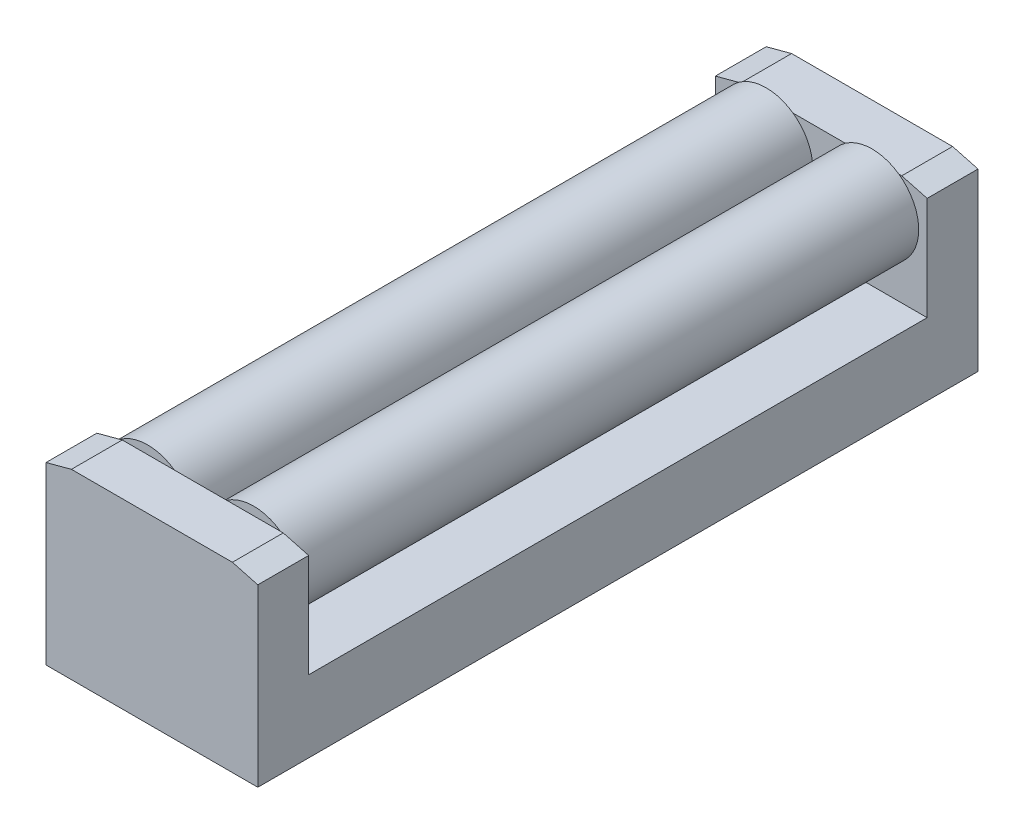
ISO-10303-21;
HEADER;
FILE_DESCRIPTION(('STEP AP214'),'2;1');
FILE_NAME('part.step','',(''),(''),'','','');
FILE_SCHEMA(('AUTOMOTIVE_DESIGN { 1 0 10303 214 1 1 1 1 }'));
ENDSEC;
DATA;
#1=APPLICATION_CONTEXT('core data for automotive mechanical design processes');
#2=APPLICATION_PROTOCOL_DEFINITION('international standard','automotive_design',2000,#1);
#3=PRODUCT_CONTEXT('',#1,'mechanical');
#4=PRODUCT('Part','Part','',(#3));
#5=PRODUCT_RELATED_PRODUCT_CATEGORY('part','',(#4));
#6=PRODUCT_DEFINITION_FORMATION('','',#4);
#7=PRODUCT_DEFINITION_CONTEXT('part definition',#1,'design');
#8=PRODUCT_DEFINITION('design','',#6,#7);
#9=PRODUCT_DEFINITION_SHAPE('','',#8);
#10=(LENGTH_UNIT() NAMED_UNIT(*) SI_UNIT(.MILLI.,.METRE.));
#11=(NAMED_UNIT(*) PLANE_ANGLE_UNIT() SI_UNIT($,.RADIAN.));
#12=(NAMED_UNIT(*) SI_UNIT($,.STERADIAN.) SOLID_ANGLE_UNIT());
#13=UNCERTAINTY_MEASURE_WITH_UNIT(LENGTH_MEASURE(1.E-05),#10,'distance_accuracy_value','');
#14=(GEOMETRIC_REPRESENTATION_CONTEXT(3) GLOBAL_UNCERTAINTY_ASSIGNED_CONTEXT((#13)) GLOBAL_UNIT_ASSIGNED_CONTEXT((#10,
#11,#12)) REPRESENTATION_CONTEXT('',''));
#15=CARTESIAN_POINT('',(0.,0.,0.));
#16=DIRECTION('',(0.,0.,1.));
#17=DIRECTION('',(1.,0.,0.));
#18=AXIS2_PLACEMENT_3D('',#15,#16,#17);
#19=CARTESIAN_POINT('',(-59.,32.1394616265751,79.));
#20=DIRECTION('',(0.,0.,1.));
#21=DIRECTION('',(1.,0.,0.));
#22=AXIS2_PLACEMENT_3D('',#19,#20,#21);
#23=PLANE('',#22);
#24=DIRECTION('',(-1.,0.,0.));
#25=VECTOR('',#24,1.);
#26=CARTESIAN_POINT('',(0.,21.5,79.));
#27=LINE('',#26,#25);
#28=CARTESIAN_POINT('',(21.9999999999999,21.5,79.));
#29=VERTEX_POINT('',#28);
#30=CARTESIAN_POINT('',(21.6622776601684,21.5,79.));
#31=VERTEX_POINT('',#30);
#32=EDGE_CURVE('E181',#29,#31,#27,.T.);
#33=ORIENTED_EDGE('',*,*,#32,.F.);
#34=DIRECTION('',(-0.965925826289069,0.258819045102519,0.));
#35=VECTOR('',#34,1.);
#36=CARTESIAN_POINT('',(22.,21.5,79.));
#37=LINE('',#36,#35);
#38=CARTESIAN_POINT('',(25.,20.6961524227066,79.));
#39=VERTEX_POINT('',#38);
#40=EDGE_CURVE('E227',#29,#39,#37,.F.);
#41=ORIENTED_EDGE('',*,*,#40,.T.);
#42=DIRECTION('',(0.,-1.,0.));
#43=VECTOR('',#42,1.);
#44=CARTESIAN_POINT('',(25.,32.139461626575,79.));
#45=LINE('',#44,#43);
#46=CARTESIAN_POINT('',(25.,8.5,79.));
#47=VERTEX_POINT('',#46);
#48=EDGE_CURVE('E335',#39,#47,#45,.T.);
#49=ORIENTED_EDGE('',*,*,#48,.T.);
#50=DIRECTION('',(1.,0.,0.));
#51=VECTOR('',#50,1.);
#52=CARTESIAN_POINT('',(-59.,8.50000000000004,79.));
#53=LINE('',#52,#51);
#54=CARTESIAN_POINT('',(0.,8.50000000000001,79.));
#55=VERTEX_POINT('',#54);
#56=EDGE_CURVE('E262',#55,#47,#53,.T.);
#57=ORIENTED_EDGE('',*,*,#56,.F.);
#58=DIRECTION('',(0.,-1.,0.));
#59=VECTOR('',#58,1.);
#60=CARTESIAN_POINT('',(0.,0.,79.));
#61=LINE('',#60,#59);
#62=CARTESIAN_POINT('',(0.,20.6961524227066,79.));
#63=VERTEX_POINT('',#62);
#64=EDGE_CURVE('E253',#63,#55,#61,.T.);
#65=ORIENTED_EDGE('',*,*,#64,.F.);
#66=DIRECTION('',(-0.965925826289069,-0.258819045102519,0.));
#67=VECTOR('',#66,1.);
#68=CARTESIAN_POINT('',(0.,20.6961524227066,79.));
#69=LINE('',#68,#67);
#70=CARTESIAN_POINT('',(2.74131560072418,21.4306857241195,79.));
#71=VERTEX_POINT('',#70);
#72=EDGE_CURVE('E224',#63,#71,#69,.F.);
#73=ORIENTED_EDGE('',*,*,#72,.T.);
#74=CARTESIAN_POINT('',(6.,17.,79.));
#75=DIRECTION('',(0.,0.,1.));
#76=DIRECTION('',(1.,0.,0.));
#77=AXIS2_PLACEMENT_3D('',#74,#75,#76);
#78=CIRCLE('',#77,5.5);
#79=CARTESIAN_POINT('',(9.16227766016838,21.5,79.));
#80=VERTEX_POINT('',#79);
#81=EDGE_CURVE('E342',#71,#80,#78,.T.);
#82=ORIENTED_EDGE('',*,*,#81,.T.);
#83=CARTESIAN_POINT('',(15.3377223398316,21.5,79.));
#84=VERTEX_POINT('',#83);
#85=EDGE_CURVE('E185',#84,#80,#27,.T.);
#86=ORIENTED_EDGE('',*,*,#85,.F.);
#87=CARTESIAN_POINT('',(18.5,17.,79.));
#88=DIRECTION('',(0.,0.,1.));
#89=DIRECTION('',(1.,0.,0.));
#90=AXIS2_PLACEMENT_3D('',#87,#88,#89);
#91=CIRCLE('',#90,5.5);
#92=EDGE_CURVE('E159',#84,#31,#91,.T.);
#93=ORIENTED_EDGE('',*,*,#92,.T.);
#94=EDGE_LOOP('',(#33,#41,#49,#57,#65,#73,#82,#86,#93));
#95=FACE_BOUND('',#94,.T.);
#96=ADVANCED_FACE('F34',(#95),#23,.F.);
#97=CARTESIAN_POINT('',(-59.,32.1394616265751,6.00000000000001));
#98=DIRECTION('',(0.,0.,-1.));
#99=DIRECTION('',(0.,1.,0.));
#100=AXIS2_PLACEMENT_3D('',#97,#98,#99);
#101=PLANE('',#100);
#102=CARTESIAN_POINT('',(6.,17.,6.00000000000001));
#103=DIRECTION('',(0.,0.,-1.));
#104=DIRECTION('',(0.,1.,0.));
#105=AXIS2_PLACEMENT_3D('',#102,#103,#104);
#106=CIRCLE('',#105,5.5);
#107=CARTESIAN_POINT('',(2.74131560072418,21.4306857241195,6.00000000000001));
#108=VERTEX_POINT('',#107);
#109=CARTESIAN_POINT('',(9.16227766016838,21.5,6.));
#110=VERTEX_POINT('',#109);
#111=EDGE_CURVE('E183',#108,#110,#106,.F.);
#112=ORIENTED_EDGE('',*,*,#111,.F.);
#113=DIRECTION('',(0.965925826289069,0.258819045102519,0.));
#114=VECTOR('',#113,1.);
#115=CARTESIAN_POINT('',(0.,20.6961524227066,6.00000000000001));
#116=LINE('',#115,#114);
#117=CARTESIAN_POINT('',(0.,20.6961524227066,6.00000000000001));
#118=VERTEX_POINT('',#117);
#119=EDGE_CURVE('E209',#108,#118,#116,.F.);
#120=ORIENTED_EDGE('',*,*,#119,.T.);
#121=DIRECTION('',(0.,1.,0.));
#122=VECTOR('',#121,1.);
#123=CARTESIAN_POINT('',(0.,0.,6.00000000000001));
#124=LINE('',#123,#122);
#125=CARTESIAN_POINT('',(0.,8.50000000000003,6.));
#126=VERTEX_POINT('',#125);
#127=EDGE_CURVE('E245',#126,#118,#124,.T.);
#128=ORIENTED_EDGE('',*,*,#127,.F.);
#129=DIRECTION('',(1.,0.,0.));
#130=VECTOR('',#129,1.);
#131=CARTESIAN_POINT('',(-59.,8.50000000000005,6.));
#132=LINE('',#131,#130);
#133=CARTESIAN_POINT('',(25.,8.50000000000001,6.));
#134=VERTEX_POINT('',#133);
#135=EDGE_CURVE('E254',#126,#134,#132,.T.);
#136=ORIENTED_EDGE('',*,*,#135,.T.);
#137=DIRECTION('',(0.,1.,0.));
#138=VECTOR('',#137,1.);
#139=CARTESIAN_POINT('',(25.,32.139461626575,6.00000000000001));
#140=LINE('',#139,#138);
#141=CARTESIAN_POINT('',(25.,20.6961524227066,6.));
#142=VERTEX_POINT('',#141);
#143=EDGE_CURVE('E325',#134,#142,#140,.T.);
#144=ORIENTED_EDGE('',*,*,#143,.T.);
#145=DIRECTION('',(0.965925826289069,-0.258819045102519,0.));
#146=VECTOR('',#145,1.);
#147=CARTESIAN_POINT('',(22.,21.5,6.00000000000001));
#148=LINE('',#147,#146);
#149=CARTESIAN_POINT('',(21.9999999999999,21.5,6.00000000000001));
#150=VERTEX_POINT('',#149);
#151=EDGE_CURVE('E207',#142,#150,#148,.F.);
#152=ORIENTED_EDGE('',*,*,#151,.T.);
#153=DIRECTION('',(1.,0.,0.));
#154=VECTOR('',#153,1.);
#155=CARTESIAN_POINT('',(0.,21.5,6.00000000000001));
#156=LINE('',#155,#154);
#157=CARTESIAN_POINT('',(21.6622776601684,21.5,6.00000000000001));
#158=VERTEX_POINT('',#157);
#159=EDGE_CURVE('E150',#158,#150,#156,.T.);
#160=ORIENTED_EDGE('',*,*,#159,.F.);
#161=CARTESIAN_POINT('',(18.5,17.,6.));
#162=DIRECTION('',(0.,0.,1.));
#163=DIRECTION('',(1.,0.,0.));
#164=AXIS2_PLACEMENT_3D('',#161,#162,#163);
#165=CIRCLE('',#164,5.5);
#166=CARTESIAN_POINT('',(15.3377223398316,21.5,6.));
#167=VERTEX_POINT('',#166);
#168=EDGE_CURVE('E156',#167,#158,#165,.T.);
#169=ORIENTED_EDGE('',*,*,#168,.F.);
#170=EDGE_CURVE('E149',#110,#167,#156,.T.);
#171=ORIENTED_EDGE('',*,*,#170,.F.);
#172=EDGE_LOOP('',(#112,#120,#128,#136,#144,#152,#160,#169,#171));
#173=FACE_BOUND('',#172,.T.);
#174=ADVANCED_FACE('F163',(#173),#101,.F.);
#175=CARTESIAN_POINT('',(0.,21.5,85.));
#176=DIRECTION('',(0.,-1.,0.));
#177=DIRECTION('',(0.,0.,-1.));
#178=AXIS2_PLACEMENT_3D('',#175,#176,#177);
#179=PLANE('',#178);
#180=DIRECTION('',(-1.,0.,0.));
#181=VECTOR('',#180,1.);
#182=CARTESIAN_POINT('',(0.,21.5,85.));
#183=LINE('',#182,#181);
#184=CARTESIAN_POINT('',(21.9999999999999,21.5,85.));
#185=VERTEX_POINT('',#184);
#186=CARTESIAN_POINT('',(3.00000000000004,21.5,85.));
#187=VERTEX_POINT('',#186);
#188=EDGE_CURVE('E290',#185,#187,#183,.T.);
#189=ORIENTED_EDGE('',*,*,#188,.F.);
#190=DIRECTION('',(0.,0.,-1.));
#191=VECTOR('',#190,1.);
#192=CARTESIAN_POINT('',(22.,21.5,85.));
#193=LINE('',#192,#191);
#194=EDGE_CURVE('E220',#185,#29,#193,.T.);
#195=ORIENTED_EDGE('',*,*,#194,.T.);
#196=ORIENTED_EDGE('',*,*,#32,.T.);
#197=EDGE_CURVE('E184',#31,#84,#27,.T.);
#198=ORIENTED_EDGE('',*,*,#197,.T.);
#199=ORIENTED_EDGE('',*,*,#85,.T.);
#200=CARTESIAN_POINT('',(3.00000000000004,21.5,79.));
#201=VERTEX_POINT('',#200);
#202=EDGE_CURVE('E176',#80,#201,#27,.T.);
#203=ORIENTED_EDGE('',*,*,#202,.T.);
#204=DIRECTION('',(0.,0.,1.));
#205=VECTOR('',#204,1.);
#206=CARTESIAN_POINT('',(3.00000000000004,21.5,85.));
#207=LINE('',#206,#205);
#208=EDGE_CURVE('E217',#201,#187,#207,.T.);
#209=ORIENTED_EDGE('',*,*,#208,.T.);
#210=EDGE_LOOP('',(#189,#195,#196,#198,#199,#203,#209));
#211=FACE_BOUND('',#210,.T.);
#212=ADVANCED_FACE('F409',(#211),#179,.F.);
#213=CARTESIAN_POINT('',(0.,0.,85.));
#214=DIRECTION('',(1.,0.,0.));
#215=DIRECTION('',(0.,0.,-1.));
#216=AXIS2_PLACEMENT_3D('',#213,#214,#215);
#217=PLANE('',#216);
#218=ORIENTED_EDGE('',*,*,#127,.T.);
#219=DIRECTION('',(0.,0.,-1.));
#220=VECTOR('',#219,1.);
#221=CARTESIAN_POINT('',(0.,20.6961524227066,85.));
#222=LINE('',#221,#220);
#223=CARTESIAN_POINT('',(0.,20.6961524227066,0.));
#224=VERTEX_POINT('',#223);
#225=EDGE_CURVE('E192',#118,#224,#222,.T.);
#226=ORIENTED_EDGE('',*,*,#225,.T.);
#227=DIRECTION('',(0.,-1.,0.));
#228=VECTOR('',#227,1.);
#229=CARTESIAN_POINT('',(0.,0.,0.));
#230=LINE('',#229,#228);
#231=CARTESIAN_POINT('',(0.,0.,0.));
#232=VERTEX_POINT('',#231);
#233=EDGE_CURVE('E268',#224,#232,#230,.T.);
#234=ORIENTED_EDGE('',*,*,#233,.T.);
#235=DIRECTION('',(0.,0.,-1.));
#236=VECTOR('',#235,1.);
#237=CARTESIAN_POINT('',(0.,0.,85.));
#238=LINE('',#237,#236);
#239=CARTESIAN_POINT('',(0.,0.,85.));
#240=VERTEX_POINT('',#239);
#241=EDGE_CURVE('E179',#240,#232,#238,.T.);
#242=ORIENTED_EDGE('',*,*,#241,.F.);
#243=DIRECTION('',(0.,-1.,0.));
#244=VECTOR('',#243,1.);
#245=CARTESIAN_POINT('',(0.,0.,85.));
#246=LINE('',#245,#244);
#247=CARTESIAN_POINT('',(0.,20.6961524227066,85.));
#248=VERTEX_POINT('',#247);
#249=EDGE_CURVE('E280',#248,#240,#246,.T.);
#250=ORIENTED_EDGE('',*,*,#249,.F.);
#251=DIRECTION('',(0.,0.,-1.));
#252=VECTOR('',#251,1.);
#253=CARTESIAN_POINT('',(0.,20.6961524227066,85.));
#254=LINE('',#253,#252);
#255=EDGE_CURVE('E188',#248,#63,#254,.T.);
#256=ORIENTED_EDGE('',*,*,#255,.T.);
#257=ORIENTED_EDGE('',*,*,#64,.T.);
#258=DIRECTION('',(0.,0.,-1.));
#259=VECTOR('',#258,1.);
#260=CARTESIAN_POINT('',(0.,8.50000000000001,85.));
#261=LINE('',#260,#259);
#262=EDGE_CURVE('E251',#55,#126,#261,.T.);
#263=ORIENTED_EDGE('',*,*,#262,.T.);
#264=EDGE_LOOP('',(#218,#226,#234,#242,#250,#256,#257,#263));
#265=FACE_BOUND('',#264,.T.);
#266=ADVANCED_FACE('F36',(#265),#217,.F.);
#267=CARTESIAN_POINT('',(0.,0.,85.));
#268=DIRECTION('',(0.,1.,0.));
#269=DIRECTION('',(0.,0.,1.));
#270=AXIS2_PLACEMENT_3D('',#267,#268,#269);
#271=PLANE('',#270);
#272=CARTESIAN_POINT('',(12.,0.,9.50000000000001));
#273=DIRECTION('',(0.,-1.,0.));
#274=DIRECTION('',(0.,0.,-1.));
#275=AXIS2_PLACEMENT_3D('',#272,#273,#274);
#276=CIRCLE('',#275,3.);
#277=CARTESIAN_POINT('',(12.,0.,6.50000000000001));
#278=VERTEX_POINT('',#277);
#279=EDGE_CURVE('E358',#278,#278,#276,.T.);
#280=ORIENTED_EDGE('',*,*,#279,.F.);
#281=EDGE_LOOP('',(#280));
#282=FACE_BOUND('',#281,.T.);
#283=CARTESIAN_POINT('',(12.,0.,75.5));
#284=DIRECTION('',(0.,-1.,0.));
#285=DIRECTION('',(0.,0.,-1.));
#286=AXIS2_PLACEMENT_3D('',#283,#284,#285);
#287=CIRCLE('',#286,3.);
#288=CARTESIAN_POINT('',(12.,0.,72.5));
#289=VERTEX_POINT('',#288);
#290=EDGE_CURVE('E350',#289,#289,#287,.T.);
#291=ORIENTED_EDGE('',*,*,#290,.F.);
#292=EDGE_LOOP('',(#291));
#293=FACE_BOUND('',#292,.T.);
#294=DIRECTION('',(1.,0.,0.));
#295=VECTOR('',#294,1.);
#296=CARTESIAN_POINT('',(0.,0.,0.));
#297=LINE('',#296,#295);
#298=CARTESIAN_POINT('',(25.,0.,0.));
#299=VERTEX_POINT('',#298);
#300=EDGE_CURVE('E271',#232,#299,#297,.T.);
#301=ORIENTED_EDGE('',*,*,#300,.T.);
#302=DIRECTION('',(0.,0.,-1.));
#303=VECTOR('',#302,1.);
#304=CARTESIAN_POINT('',(25.,0.,85.));
#305=LINE('',#304,#303);
#306=CARTESIAN_POINT('',(25.,0.,85.));
#307=VERTEX_POINT('',#306);
#308=EDGE_CURVE('E293',#307,#299,#305,.T.);
#309=ORIENTED_EDGE('',*,*,#308,.F.);
#310=DIRECTION('',(1.,0.,0.));
#311=VECTOR('',#310,1.);
#312=CARTESIAN_POINT('',(0.,0.,85.));
#313=LINE('',#312,#311);
#314=EDGE_CURVE('E283',#240,#307,#313,.T.);
#315=ORIENTED_EDGE('',*,*,#314,.F.);
#316=ORIENTED_EDGE('',*,*,#241,.T.);
#317=EDGE_LOOP('',(#301,#309,#315,#316));
#318=FACE_BOUND('',#317,.T.);
#319=ADVANCED_FACE('F367',(#282,#293,#318),#271,.F.);
#320=CARTESIAN_POINT('',(25.,0.,85.));
#321=DIRECTION('',(-1.,0.,0.));
#322=DIRECTION('',(0.,0.,1.));
#323=AXIS2_PLACEMENT_3D('',#320,#321,#322);
#324=PLANE('',#323);
#325=DIRECTION('',(0.,1.,0.));
#326=VECTOR('',#325,1.);
#327=CARTESIAN_POINT('',(25.,0.,0.));
#328=LINE('',#327,#326);
#329=CARTESIAN_POINT('',(25.,20.6961524227066,0.));
#330=VERTEX_POINT('',#329);
#331=EDGE_CURVE('E274',#299,#330,#328,.T.);
#332=ORIENTED_EDGE('',*,*,#331,.T.);
#333=DIRECTION('',(0.,0.,1.));
#334=VECTOR('',#333,1.);
#335=CARTESIAN_POINT('',(25.,20.6961524227066,85.));
#336=LINE('',#335,#334);
#337=EDGE_CURVE('E214',#330,#142,#336,.T.);
#338=ORIENTED_EDGE('',*,*,#337,.T.);
#339=ORIENTED_EDGE('',*,*,#143,.F.);
#340=DIRECTION('',(0.,0.,-1.));
#341=VECTOR('',#340,1.);
#342=CARTESIAN_POINT('',(25.,8.5,79.));
#343=LINE('',#342,#341);
#344=EDGE_CURVE('E328',#47,#134,#343,.T.);
#345=ORIENTED_EDGE('',*,*,#344,.F.);
#346=ORIENTED_EDGE('',*,*,#48,.F.);
#347=DIRECTION('',(0.,0.,1.));
#348=VECTOR('',#347,1.);
#349=CARTESIAN_POINT('',(25.,20.6961524227066,85.));
#350=LINE('',#349,#348);
#351=CARTESIAN_POINT('',(25.,20.6961524227066,85.));
#352=VERTEX_POINT('',#351);
#353=EDGE_CURVE('E211',#39,#352,#350,.T.);
#354=ORIENTED_EDGE('',*,*,#353,.T.);
#355=DIRECTION('',(0.,1.,0.));
#356=VECTOR('',#355,1.);
#357=CARTESIAN_POINT('',(25.,0.,85.));
#358=LINE('',#357,#356);
#359=EDGE_CURVE('E286',#307,#352,#358,.T.);
#360=ORIENTED_EDGE('',*,*,#359,.F.);
#361=ORIENTED_EDGE('',*,*,#308,.T.);
#362=EDGE_LOOP('',(#332,#338,#339,#345,#346,#354,#360,#361));
#363=FACE_BOUND('',#362,.T.);
#364=ADVANCED_FACE('F321',(#363),#324,.F.);
#365=DIRECTION('',(-1.,0.,0.));
#366=VECTOR('',#365,1.);
#367=CARTESIAN_POINT('',(0.,21.5,0.));
#368=LINE('',#367,#366);
#369=CARTESIAN_POINT('',(22.,21.5,0.));
#370=VERTEX_POINT('',#369);
#371=CARTESIAN_POINT('',(3.00000000000004,21.5,0.));
#372=VERTEX_POINT('',#371);
#373=EDGE_CURVE('E278',#370,#372,#368,.T.);
#374=ORIENTED_EDGE('',*,*,#373,.T.);
#375=DIRECTION('',(0.,0.,1.));
#376=VECTOR('',#375,1.);
#377=CARTESIAN_POINT('',(3.00000000000004,21.5,85.));
#378=LINE('',#377,#376);
#379=CARTESIAN_POINT('',(3.00000000000004,21.5,6.00000000000001));
#380=VERTEX_POINT('',#379);
#381=EDGE_CURVE('E204',#372,#380,#378,.T.);
#382=ORIENTED_EDGE('',*,*,#381,.T.);
#383=EDGE_CURVE('E170',#380,#110,#156,.T.);
#384=ORIENTED_EDGE('',*,*,#383,.T.);
#385=ORIENTED_EDGE('',*,*,#170,.T.);
#386=EDGE_CURVE('E141',#167,#158,#156,.T.);
#387=ORIENTED_EDGE('',*,*,#386,.T.);
#388=ORIENTED_EDGE('',*,*,#159,.T.);
#389=DIRECTION('',(0.,0.,-1.));
#390=VECTOR('',#389,1.);
#391=CARTESIAN_POINT('',(22.,21.5,85.));
#392=LINE('',#391,#390);
#393=EDGE_CURVE('E200',#150,#370,#392,.T.);
#394=ORIENTED_EDGE('',*,*,#393,.T.);
#395=EDGE_LOOP('',(#374,#382,#384,#385,#387,#388,#394));
#396=FACE_BOUND('',#395,.T.);
#397=ADVANCED_FACE('F168',(#396),#179,.F.);
#398=CARTESIAN_POINT('',(0.,21.5,85.));
#399=DIRECTION('',(0.,0.,-1.));
#400=DIRECTION('',(-1.,0.,0.));
#401=AXIS2_PLACEMENT_3D('',#398,#399,#400);
#402=PLANE('',#401);
#403=ORIENTED_EDGE('',*,*,#359,.T.);
#404=DIRECTION('',(0.965925826289069,-0.258819045102519,0.));
#405=VECTOR('',#404,1.);
#406=CARTESIAN_POINT('',(22.,21.5,85.));
#407=LINE('',#406,#405);
#408=EDGE_CURVE('E233',#352,#185,#407,.F.);
#409=ORIENTED_EDGE('',*,*,#408,.T.);
#410=ORIENTED_EDGE('',*,*,#188,.T.);
#411=DIRECTION('',(0.965925826289069,0.258819045102519,0.));
#412=VECTOR('',#411,1.);
#413=CARTESIAN_POINT('',(0.,20.6961524227066,85.));
#414=LINE('',#413,#412);
#415=EDGE_CURVE('E230',#187,#248,#414,.F.);
#416=ORIENTED_EDGE('',*,*,#415,.T.);
#417=ORIENTED_EDGE('',*,*,#249,.T.);
#418=ORIENTED_EDGE('',*,*,#314,.T.);
#419=EDGE_LOOP('',(#403,#409,#410,#416,#417,#418));
#420=FACE_BOUND('',#419,.T.);
#421=ADVANCED_FACE('F430',(#420),#402,.F.);
#422=CARTESIAN_POINT('',(0.,21.5,0.));
#423=DIRECTION('',(0.,0.,-1.));
#424=DIRECTION('',(-1.,0.,0.));
#425=AXIS2_PLACEMENT_3D('',#422,#423,#424);
#426=PLANE('',#425);
#427=ORIENTED_EDGE('',*,*,#233,.F.);
#428=DIRECTION('',(-0.965925826289069,-0.258819045102519,0.));
#429=VECTOR('',#428,1.);
#430=CARTESIAN_POINT('',(0.200961894323342,20.75,0.));
#431=LINE('',#430,#429);
#432=EDGE_CURVE('E198',#224,#372,#431,.F.);
#433=ORIENTED_EDGE('',*,*,#432,.T.);
#434=ORIENTED_EDGE('',*,*,#373,.F.);
#435=DIRECTION('',(-0.965925826289069,0.258819045102519,0.));
#436=VECTOR('',#435,1.);
#437=CARTESIAN_POINT('',(1.47372055837115,26.9999999999999,0.));
#438=LINE('',#437,#436);
#439=EDGE_CURVE('E196',#370,#330,#438,.F.);
#440=ORIENTED_EDGE('',*,*,#439,.T.);
#441=ORIENTED_EDGE('',*,*,#331,.F.);
#442=ORIENTED_EDGE('',*,*,#300,.F.);
#443=EDGE_LOOP('',(#427,#433,#434,#440,#441,#442));
#444=FACE_BOUND('',#443,.T.);
#445=ADVANCED_FACE('F319',(#444),#426,.T.);
#446=CARTESIAN_POINT('',(-59.,8.50000000000004,79.));
#447=DIRECTION('',(0.,-1.,0.));
#448=DIRECTION('',(1.,0.,0.));
#449=AXIS2_PLACEMENT_3D('',#446,#447,#448);
#450=PLANE('',#449);
#451=CARTESIAN_POINT('',(12.,8.50000000000002,9.50000000000001));
#452=DIRECTION('',(0.,-1.,0.));
#453=DIRECTION('',(1.,0.,0.));
#454=AXIS2_PLACEMENT_3D('',#451,#452,#453);
#455=CIRCLE('',#454,3.);
#456=CARTESIAN_POINT('',(15.,8.50000000000002,9.50000000000001));
#457=VERTEX_POINT('',#456);
#458=EDGE_CURVE('E354',#457,#457,#455,.F.);
#459=ORIENTED_EDGE('',*,*,#458,.F.);
#460=EDGE_LOOP('',(#459));
#461=FACE_BOUND('',#460,.T.);
#462=CARTESIAN_POINT('',(12.,8.50000000000001,75.5));
#463=DIRECTION('',(0.,-1.,0.));
#464=DIRECTION('',(1.,0.,0.));
#465=AXIS2_PLACEMENT_3D('',#462,#463,#464);
#466=CIRCLE('',#465,3.);
#467=CARTESIAN_POINT('',(15.,8.50000000000001,75.5));
#468=VERTEX_POINT('',#467);
#469=EDGE_CURVE('E165',#468,#468,#466,.F.);
#470=ORIENTED_EDGE('',*,*,#469,.F.);
#471=EDGE_LOOP('',(#470));
#472=FACE_BOUND('',#471,.T.);
#473=ORIENTED_EDGE('',*,*,#56,.T.);
#474=ORIENTED_EDGE('',*,*,#344,.T.);
#475=ORIENTED_EDGE('',*,*,#135,.F.);
#476=ORIENTED_EDGE('',*,*,#262,.F.);
#477=EDGE_LOOP('',(#473,#474,#475,#476));
#478=FACE_BOUND('',#477,.T.);
#479=ADVANCED_FACE('F448',(#461,#472,#478),#450,.F.);
#480=CARTESIAN_POINT('',(-59.,32.1394616265751,79.));
#481=DIRECTION('',(0.,0.,1.));
#482=DIRECTION('',(1.,0.,0.));
#483=AXIS2_PLACEMENT_3D('',#480,#481,#482);
#484=PLANE('',#483);
#485=ORIENTED_EDGE('',*,*,#202,.F.);
#486=EDGE_CURVE('E340',#80,#71,#78,.T.);
#487=ORIENTED_EDGE('',*,*,#486,.T.);
#488=DIRECTION('',(-0.965925826289069,-0.258819045102519,0.));
#489=VECTOR('',#488,1.);
#490=CARTESIAN_POINT('',(0.,20.6961524227066,79.));
#491=LINE('',#490,#489);
#492=EDGE_CURVE('E11',#71,#201,#491,.F.);
#493=ORIENTED_EDGE('',*,*,#492,.T.);
#494=EDGE_LOOP('',(#485,#487,#493));
#495=FACE_BOUND('',#494,.T.);
#496=ADVANCED_FACE('F454',(#495),#484,.T.);
#497=CARTESIAN_POINT('',(6.,17.,6.));
#498=DIRECTION('',(0.,0.,1.));
#499=DIRECTION('',(1.,0.,0.));
#500=AXIS2_PLACEMENT_3D('',#497,#498,#499);
#501=PLANE('',#500);
#502=CARTESIAN_POINT('',(6.,17.,6.));
#503=DIRECTION('',(0.,0.,1.));
#504=DIRECTION('',(1.,0.,0.));
#505=AXIS2_PLACEMENT_3D('',#502,#503,#504);
#506=CIRCLE('',#505,5.5);
#507=EDGE_CURVE('E48',#110,#108,#506,.T.);
#508=ORIENTED_EDGE('',*,*,#507,.F.);
#509=ORIENTED_EDGE('',*,*,#383,.F.);
#510=DIRECTION('',(0.965925826289069,0.258819045102519,0.));
#511=VECTOR('',#510,1.);
#512=CARTESIAN_POINT('',(4.67403810567667,21.948557158515,6.));
#513=LINE('',#512,#511);
#514=EDGE_CURVE('E43',#380,#108,#513,.F.);
#515=ORIENTED_EDGE('',*,*,#514,.T.);
#516=EDGE_LOOP('',(#508,#509,#515));
#517=FACE_BOUND('',#516,.T.);
#518=ADVANCED_FACE('F239',(#517),#501,.F.);
#519=CARTESIAN_POINT('',(6.,17.,94.556349186104));
#520=DIRECTION('',(0.,0.,-1.));
#521=DIRECTION('',(-1.,0.,0.));
#522=AXIS2_PLACEMENT_3D('',#519,#520,#521);
#523=CYLINDRICAL_SURFACE('',#522,5.5);
#524=ORIENTED_EDGE('',*,*,#507,.T.);
#525=ORIENTED_EDGE('',*,*,#111,.T.);
#526=EDGE_LOOP('',(#524,#525));
#527=FACE_BOUND('',#526,.T.);
#528=ORIENTED_EDGE('',*,*,#486,.F.);
#529=ORIENTED_EDGE('',*,*,#81,.F.);
#530=EDGE_LOOP('',(#528,#529));
#531=FACE_BOUND('',#530,.T.);
#532=ADVANCED_FACE('F388',(#527,#531),#523,.T.);
#533=CARTESIAN_POINT('',(-59.,32.1394616265751,79.));
#534=DIRECTION('',(0.,0.,1.));
#535=DIRECTION('',(1.,0.,0.));
#536=AXIS2_PLACEMENT_3D('',#533,#534,#535);
#537=PLANE('',#536);
#538=ORIENTED_EDGE('',*,*,#197,.F.);
#539=EDGE_CURVE('E345',#31,#84,#91,.T.);
#540=ORIENTED_EDGE('',*,*,#539,.T.);
#541=EDGE_LOOP('',(#538,#540));
#542=FACE_BOUND('',#541,.T.);
#543=ADVANCED_FACE('F477',(#542),#537,.T.);
#544=CARTESIAN_POINT('',(18.5,17.,6.));
#545=DIRECTION('',(0.,0.,1.));
#546=DIRECTION('',(1.,0.,0.));
#547=AXIS2_PLACEMENT_3D('',#544,#545,#546);
#548=PLANE('',#547);
#549=EDGE_CURVE('E144',#158,#167,#165,.T.);
#550=ORIENTED_EDGE('',*,*,#549,.F.);
#551=ORIENTED_EDGE('',*,*,#386,.F.);
#552=EDGE_LOOP('',(#550,#551));
#553=FACE_BOUND('',#552,.T.);
#554=ADVANCED_FACE('F143',(#553),#548,.F.);
#555=CARTESIAN_POINT('',(18.5,17.,94.556349186104));
#556=DIRECTION('',(0.,0.,-1.));
#557=DIRECTION('',(-1.,0.,0.));
#558=AXIS2_PLACEMENT_3D('',#555,#556,#557);
#559=CYLINDRICAL_SURFACE('',#558,5.5);
#560=ORIENTED_EDGE('',*,*,#549,.T.);
#561=ORIENTED_EDGE('',*,*,#168,.T.);
#562=EDGE_LOOP('',(#560,#561));
#563=FACE_BOUND('',#562,.T.);
#564=ORIENTED_EDGE('',*,*,#539,.F.);
#565=ORIENTED_EDGE('',*,*,#92,.F.);
#566=EDGE_LOOP('',(#564,#565));
#567=FACE_BOUND('',#566,.T.);
#568=ADVANCED_FACE('F154',(#563,#567),#559,.T.);
#569=CARTESIAN_POINT('',(0.,20.6961524227066,85.));
#570=DIRECTION('',(0.258819045102519,-0.965925826289069,0.));
#571=DIRECTION('',(0.965925826289069,0.258819045102519,0.));
#572=AXIS2_PLACEMENT_3D('',#569,#570,#571);
#573=PLANE('',#572);
#574=ORIENTED_EDGE('',*,*,#514,.F.);
#575=ORIENTED_EDGE('',*,*,#381,.F.);
#576=ORIENTED_EDGE('',*,*,#432,.F.);
#577=ORIENTED_EDGE('',*,*,#225,.F.);
#578=ORIENTED_EDGE('',*,*,#119,.F.);
#579=EDGE_LOOP('',(#574,#575,#576,#577,#578));
#580=FACE_BOUND('',#579,.T.);
#581=ADVANCED_FACE('F243',(#580),#573,.F.);
#582=CARTESIAN_POINT('',(22.,21.5,85.));
#583=DIRECTION('',(-0.258819045102519,-0.965925826289069,0.));
#584=DIRECTION('',(0.965925826289069,-0.258819045102519,0.));
#585=AXIS2_PLACEMENT_3D('',#582,#583,#584);
#586=PLANE('',#585);
#587=ORIENTED_EDGE('',*,*,#151,.F.);
#588=ORIENTED_EDGE('',*,*,#337,.F.);
#589=ORIENTED_EDGE('',*,*,#439,.F.);
#590=ORIENTED_EDGE('',*,*,#393,.F.);
#591=EDGE_LOOP('',(#587,#588,#589,#590));
#592=FACE_BOUND('',#591,.T.);
#593=ADVANCED_FACE('F316',(#592),#586,.F.);
#594=CARTESIAN_POINT('',(22.,21.5,85.));
#595=DIRECTION('',(-0.258819045102519,-0.965925826289069,0.));
#596=DIRECTION('',(0.965925826289069,-0.258819045102519,0.));
#597=AXIS2_PLACEMENT_3D('',#594,#595,#596);
#598=PLANE('',#597);
#599=ORIENTED_EDGE('',*,*,#408,.F.);
#600=ORIENTED_EDGE('',*,*,#353,.F.);
#601=ORIENTED_EDGE('',*,*,#40,.F.);
#602=ORIENTED_EDGE('',*,*,#194,.F.);
#603=EDGE_LOOP('',(#599,#600,#601,#602));
#604=FACE_BOUND('',#603,.T.);
#605=ADVANCED_FACE('F552',(#604),#598,.F.);
#606=CARTESIAN_POINT('',(0.,20.6961524227066,85.));
#607=DIRECTION('',(0.258819045102519,-0.965925826289069,0.));
#608=DIRECTION('',(0.965925826289069,0.258819045102519,0.));
#609=AXIS2_PLACEMENT_3D('',#606,#607,#608);
#610=PLANE('',#609);
#611=ORIENTED_EDGE('',*,*,#415,.F.);
#612=ORIENTED_EDGE('',*,*,#208,.F.);
#613=ORIENTED_EDGE('',*,*,#492,.F.);
#614=ORIENTED_EDGE('',*,*,#72,.F.);
#615=ORIENTED_EDGE('',*,*,#255,.F.);
#616=EDGE_LOOP('',(#611,#612,#613,#614,#615));
#617=FACE_BOUND('',#616,.T.);
#618=ADVANCED_FACE('F377',(#617),#610,.F.);
#619=CARTESIAN_POINT('',(12.,16.9852813742386,75.5));
#620=DIRECTION('',(0.,-1.,0.));
#621=DIRECTION('',(0.,0.,-1.));
#622=AXIS2_PLACEMENT_3D('',#619,#620,#621);
#623=CYLINDRICAL_SURFACE('',#622,3.);
#624=ORIENTED_EDGE('',*,*,#469,.T.);
#625=EDGE_LOOP('',(#624));
#626=FACE_BOUND('',#625,.T.);
#627=ORIENTED_EDGE('',*,*,#290,.T.);
#628=EDGE_LOOP('',(#627));
#629=FACE_BOUND('',#628,.T.);
#630=ADVANCED_FACE('F529',(#626,#629),#623,.F.);
#631=CARTESIAN_POINT('',(12.,16.9852813742386,9.50000000000001));
#632=DIRECTION('',(0.,-1.,0.));
#633=DIRECTION('',(0.,0.,-1.));
#634=AXIS2_PLACEMENT_3D('',#631,#632,#633);
#635=CYLINDRICAL_SURFACE('',#634,3.);
#636=ORIENTED_EDGE('',*,*,#458,.T.);
#637=EDGE_LOOP('',(#636));
#638=FACE_BOUND('',#637,.T.);
#639=ORIENTED_EDGE('',*,*,#279,.T.);
#640=EDGE_LOOP('',(#639));
#641=FACE_BOUND('',#640,.T.);
#642=ADVANCED_FACE('F365',(#638,#641),#635,.F.);
#643=CLOSED_SHELL('',(#96,#174,#212,#266,#319,#364,#397,#421,#445,#479,#496,#518,#532,#543,#554,
#568,#581,#593,#605,#618,#630,#642));
#644=MANIFOLD_SOLID_BREP('B2',#643);
#645=ADVANCED_BREP_SHAPE_REPRESENTATION('',(#18,#644),#14);
#646=SHAPE_DEFINITION_REPRESENTATION(#9,#645);
ENDSEC;
END-ISO-10303-21;
